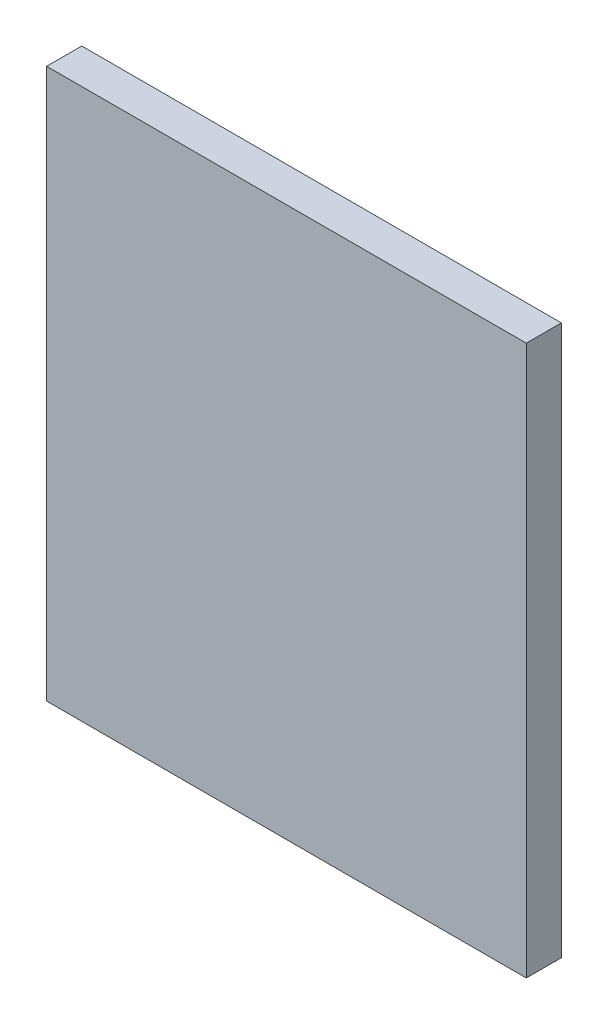
ISO-10303-21;
HEADER;
FILE_DESCRIPTION(('STEP AP214'),'2;1');
FILE_NAME('part.step','',(''),(''),'','','');
FILE_SCHEMA(('AUTOMOTIVE_DESIGN { 1 0 10303 214 1 1 1 1 }'));
ENDSEC;
DATA;
#1=APPLICATION_CONTEXT('core data for automotive mechanical design processes');
#2=APPLICATION_PROTOCOL_DEFINITION('international standard','automotive_design',2000,#1);
#3=PRODUCT_CONTEXT('',#1,'mechanical');
#4=PRODUCT('Part','Part','',(#3));
#5=PRODUCT_RELATED_PRODUCT_CATEGORY('part','',(#4));
#6=PRODUCT_DEFINITION_FORMATION('','',#4);
#7=PRODUCT_DEFINITION_CONTEXT('part definition',#1,'design');
#8=PRODUCT_DEFINITION('design','',#6,#7);
#9=PRODUCT_DEFINITION_SHAPE('','',#8);
#10=(LENGTH_UNIT() NAMED_UNIT(*) SI_UNIT(.MILLI.,.METRE.));
#11=(NAMED_UNIT(*) PLANE_ANGLE_UNIT() SI_UNIT($,.RADIAN.));
#12=(NAMED_UNIT(*) SI_UNIT($,.STERADIAN.) SOLID_ANGLE_UNIT());
#13=UNCERTAINTY_MEASURE_WITH_UNIT(LENGTH_MEASURE(1.E-05),#10,'distance_accuracy_value','');
#14=(GEOMETRIC_REPRESENTATION_CONTEXT(3) GLOBAL_UNCERTAINTY_ASSIGNED_CONTEXT((#13)) GLOBAL_UNIT_ASSIGNED_CONTEXT((#10,
#11,#12)) REPRESENTATION_CONTEXT('',''));
#15=CARTESIAN_POINT('',(0.,0.,0.));
#16=DIRECTION('',(0.,0.,1.));
#17=DIRECTION('',(1.,0.,0.));
#18=AXIS2_PLACEMENT_3D('',#15,#16,#17);
#19=CARTESIAN_POINT('',(-162.687637969095,313.421633554084,30.));
#20=DIRECTION('',(1.,0.,0.));
#21=DIRECTION('',(0.,1.,0.));
#22=AXIS2_PLACEMENT_3D('',#19,#20,#21);
#23=PLANE('',#22);
#24=DIRECTION('',(0.,-1.,0.));
#25=VECTOR('',#24,1.);
#26=CARTESIAN_POINT('',(-162.687637969095,313.421633554084,0.));
#27=LINE('',#26,#25);
#28=CARTESIAN_POINT('',(-162.687637969095,313.421633554084,0.));
#29=VERTEX_POINT('',#28);
#30=CARTESIAN_POINT('',(-162.687637969095,-156.578366445916,0.));
#31=VERTEX_POINT('',#30);
#32=EDGE_CURVE('E96',#29,#31,#27,.T.);
#33=ORIENTED_EDGE('',*,*,#32,.T.);
#34=DIRECTION('',(0.,0.,-1.));
#35=VECTOR('',#34,1.);
#36=CARTESIAN_POINT('',(-162.687637969095,-156.578366445916,30.));
#37=LINE('',#36,#35);
#38=CARTESIAN_POINT('',(-162.687637969095,-156.578366445916,30.));
#39=VERTEX_POINT('',#38);
#40=EDGE_CURVE('E11',#39,#31,#37,.T.);
#41=ORIENTED_EDGE('',*,*,#40,.F.);
#42=DIRECTION('',(0.,-1.,0.));
#43=VECTOR('',#42,1.);
#44=CARTESIAN_POINT('',(-162.687637969095,313.421633554084,30.));
#45=LINE('',#44,#43);
#46=CARTESIAN_POINT('',(-162.687637969095,313.421633554084,30.));
#47=VERTEX_POINT('',#46);
#48=EDGE_CURVE('E84',#47,#39,#45,.T.);
#49=ORIENTED_EDGE('',*,*,#48,.F.);
#50=DIRECTION('',(0.,0.,-1.));
#51=VECTOR('',#50,1.);
#52=CARTESIAN_POINT('',(-162.687637969095,313.421633554084,30.));
#53=LINE('',#52,#51);
#54=EDGE_CURVE('E92',#47,#29,#53,.T.);
#55=ORIENTED_EDGE('',*,*,#54,.T.);
#56=EDGE_LOOP('',(#33,#41,#49,#55));
#57=FACE_BOUND('',#56,.T.);
#58=ADVANCED_FACE('F33',(#57),#23,.F.);
#59=CARTESIAN_POINT('',(-162.687637969095,-156.578366445916,30.));
#60=DIRECTION('',(0.,1.,0.));
#61=DIRECTION('',(0.,0.,1.));
#62=AXIS2_PLACEMENT_3D('',#59,#60,#61);
#63=PLANE('',#62);
#64=DIRECTION('',(1.,0.,0.));
#65=VECTOR('',#64,1.);
#66=CARTESIAN_POINT('',(-162.687637969095,-156.578366445916,0.));
#67=LINE('',#66,#65);
#68=CARTESIAN_POINT('',(247.312362030905,-156.578366445916,0.));
#69=VERTEX_POINT('',#68);
#70=EDGE_CURVE('E88',#31,#69,#67,.T.);
#71=ORIENTED_EDGE('',*,*,#70,.T.);
#72=DIRECTION('',(0.,0.,-1.));
#73=VECTOR('',#72,1.);
#74=CARTESIAN_POINT('',(247.312362030905,-156.578366445916,30.));
#75=LINE('',#74,#73);
#76=CARTESIAN_POINT('',(247.312362030905,-156.578366445916,30.));
#77=VERTEX_POINT('',#76);
#78=EDGE_CURVE('E41',#77,#69,#75,.T.);
#79=ORIENTED_EDGE('',*,*,#78,.F.);
#80=DIRECTION('',(1.,0.,0.));
#81=VECTOR('',#80,1.);
#82=CARTESIAN_POINT('',(-162.687637969095,-156.578366445916,30.));
#83=LINE('',#82,#81);
#84=EDGE_CURVE('E79',#39,#77,#83,.T.);
#85=ORIENTED_EDGE('',*,*,#84,.F.);
#86=ORIENTED_EDGE('',*,*,#40,.T.);
#87=EDGE_LOOP('',(#71,#79,#85,#86));
#88=FACE_BOUND('',#87,.T.);
#89=ADVANCED_FACE('F87',(#88),#63,.F.);
#90=CARTESIAN_POINT('',(247.312362030905,313.421633554084,30.));
#91=DIRECTION('',(-1.,0.,0.));
#92=DIRECTION('',(0.,-1.,0.));
#93=AXIS2_PLACEMENT_3D('',#90,#91,#92);
#94=PLANE('',#93);
#95=DIRECTION('',(0.,1.,0.));
#96=VECTOR('',#95,1.);
#97=CARTESIAN_POINT('',(247.312362030905,313.421633554084,0.));
#98=LINE('',#97,#96);
#99=CARTESIAN_POINT('',(247.312362030905,313.421633554084,0.));
#100=VERTEX_POINT('',#99);
#101=EDGE_CURVE('E66',#69,#100,#98,.T.);
#102=ORIENTED_EDGE('',*,*,#101,.T.);
#103=DIRECTION('',(0.,0.,-1.));
#104=VECTOR('',#103,1.);
#105=CARTESIAN_POINT('',(247.312362030905,313.421633554084,30.));
#106=LINE('',#105,#104);
#107=CARTESIAN_POINT('',(247.312362030905,313.421633554084,30.));
#108=VERTEX_POINT('',#107);
#109=EDGE_CURVE('E89',#108,#100,#106,.T.);
#110=ORIENTED_EDGE('',*,*,#109,.F.);
#111=DIRECTION('',(0.,1.,0.));
#112=VECTOR('',#111,1.);
#113=CARTESIAN_POINT('',(247.312362030905,313.421633554084,30.));
#114=LINE('',#113,#112);
#115=EDGE_CURVE('E82',#77,#108,#114,.T.);
#116=ORIENTED_EDGE('',*,*,#115,.F.);
#117=ORIENTED_EDGE('',*,*,#78,.T.);
#118=EDGE_LOOP('',(#102,#110,#116,#117));
#119=FACE_BOUND('',#118,.T.);
#120=ADVANCED_FACE('F90',(#119),#94,.F.);
#121=CARTESIAN_POINT('',(-162.687637969095,313.421633554084,30.));
#122=DIRECTION('',(0.,-1.,0.));
#123=DIRECTION('',(0.,0.,-1.));
#124=AXIS2_PLACEMENT_3D('',#121,#122,#123);
#125=PLANE('',#124);
#126=DIRECTION('',(-1.,0.,0.));
#127=VECTOR('',#126,1.);
#128=CARTESIAN_POINT('',(-162.687637969095,313.421633554084,0.));
#129=LINE('',#128,#127);
#130=EDGE_CURVE('E72',#100,#29,#129,.T.);
#131=ORIENTED_EDGE('',*,*,#130,.T.);
#132=ORIENTED_EDGE('',*,*,#54,.F.);
#133=DIRECTION('',(-1.,0.,0.));
#134=VECTOR('',#133,1.);
#135=CARTESIAN_POINT('',(-162.687637969095,313.421633554084,30.));
#136=LINE('',#135,#134);
#137=EDGE_CURVE('E49',#108,#47,#136,.T.);
#138=ORIENTED_EDGE('',*,*,#137,.F.);
#139=ORIENTED_EDGE('',*,*,#109,.T.);
#140=EDGE_LOOP('',(#131,#132,#138,#139));
#141=FACE_BOUND('',#140,.T.);
#142=ADVANCED_FACE('F103',(#141),#125,.F.);
#143=CARTESIAN_POINT('',(0.,0.,30.));
#144=DIRECTION('',(0.,0.,1.));
#145=DIRECTION('',(1.,0.,0.));
#146=AXIS2_PLACEMENT_3D('',#143,#144,#145);
#147=PLANE('',#146);
#148=ORIENTED_EDGE('',*,*,#48,.T.);
#149=ORIENTED_EDGE('',*,*,#84,.T.);
#150=ORIENTED_EDGE('',*,*,#115,.T.);
#151=ORIENTED_EDGE('',*,*,#137,.T.);
#152=EDGE_LOOP('',(#148,#149,#150,#151));
#153=FACE_BOUND('',#152,.T.);
#154=ADVANCED_FACE('F80',(#153),#147,.T.);
#155=CARTESIAN_POINT('',(0.,0.,0.));
#156=DIRECTION('',(0.,0.,1.));
#157=DIRECTION('',(1.,0.,0.));
#158=AXIS2_PLACEMENT_3D('',#155,#156,#157);
#159=PLANE('',#158);
#160=ORIENTED_EDGE('',*,*,#32,.F.);
#161=ORIENTED_EDGE('',*,*,#130,.F.);
#162=ORIENTED_EDGE('',*,*,#101,.F.);
#163=ORIENTED_EDGE('',*,*,#70,.F.);
#164=EDGE_LOOP('',(#160,#161,#162,#163));
#165=FACE_BOUND('',#164,.T.);
#166=ADVANCED_FACE('F106',(#165),#159,.F.);
#167=CLOSED_SHELL('',(#58,#89,#120,#142,#154,#166));
#168=MANIFOLD_SOLID_BREP('B2',#167);
#169=ADVANCED_BREP_SHAPE_REPRESENTATION('',(#18,#168),#14);
#170=SHAPE_DEFINITION_REPRESENTATION(#9,#169);
ENDSEC;
END-ISO-10303-21;
